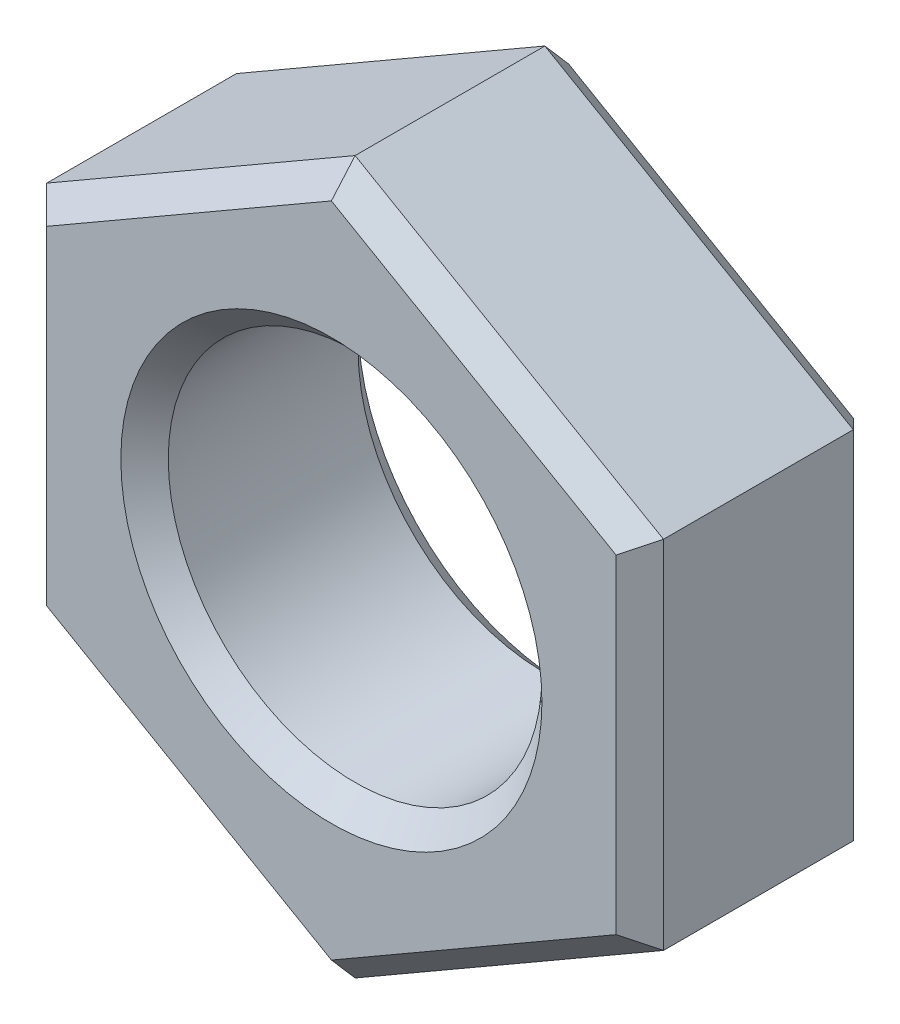
ISO-10303-21;
HEADER;
FILE_DESCRIPTION(('STEP AP214'),'2;1');
FILE_NAME('part.step','',(''),(''),'','','');
FILE_SCHEMA(('AUTOMOTIVE_DESIGN { 1 0 10303 214 1 1 1 1 }'));
ENDSEC;
DATA;
#1=APPLICATION_CONTEXT('core data for automotive mechanical design processes');
#2=APPLICATION_PROTOCOL_DEFINITION('international standard','automotive_design',2000,#1);
#3=PRODUCT_CONTEXT('',#1,'mechanical');
#4=PRODUCT('Part','Part','',(#3));
#5=PRODUCT_RELATED_PRODUCT_CATEGORY('part','',(#4));
#6=PRODUCT_DEFINITION_FORMATION('','',#4);
#7=PRODUCT_DEFINITION_CONTEXT('part definition',#1,'design');
#8=PRODUCT_DEFINITION('design','',#6,#7);
#9=PRODUCT_DEFINITION_SHAPE('','',#8);
#10=(LENGTH_UNIT() NAMED_UNIT(*) SI_UNIT(.MILLI.,.METRE.));
#11=(NAMED_UNIT(*) PLANE_ANGLE_UNIT() SI_UNIT($,.RADIAN.));
#12=(NAMED_UNIT(*) SI_UNIT($,.STERADIAN.) SOLID_ANGLE_UNIT());
#13=UNCERTAINTY_MEASURE_WITH_UNIT(LENGTH_MEASURE(1.E-05),#10,'distance_accuracy_value','');
#14=(GEOMETRIC_REPRESENTATION_CONTEXT(3) GLOBAL_UNCERTAINTY_ASSIGNED_CONTEXT((#13)) GLOBAL_UNIT_ASSIGNED_CONTEXT((#10,
#11,#12)) REPRESENTATION_CONTEXT('',''));
#15=CARTESIAN_POINT('',(0.,0.,0.));
#16=DIRECTION('',(0.,0.,1.));
#17=DIRECTION('',(1.,0.,0.));
#18=AXIS2_PLACEMENT_3D('',#15,#16,#17);
#19=CARTESIAN_POINT('',(0.,0.,1.));
#20=DIRECTION('',(0.,0.,1.));
#21=DIRECTION('',(1.,0.,0.));
#22=AXIS2_PLACEMENT_3D('',#19,#20,#21);
#23=PLANE('',#22);
#24=CARTESIAN_POINT('',(0.,0.,1.));
#25=DIRECTION('',(0.,0.,1.));
#26=DIRECTION('',(1.,0.,0.));
#27=AXIS2_PLACEMENT_3D('',#24,#25,#26);
#28=CIRCLE('',#27,1.775);
#29=CARTESIAN_POINT('',(1.775,0.,1.));
#30=VERTEX_POINT('',#29);
#31=EDGE_CURVE('E11',#30,#30,#28,.F.);
#32=ORIENTED_EDGE('',*,*,#31,.T.);
#33=EDGE_LOOP('',(#32));
#34=FACE_BOUND('',#33,.T.);
#35=DIRECTION('',(0.,-1.,0.));
#36=VECTOR('',#35,1.);
#37=CARTESIAN_POINT('',(-2.4,-1.50111069989303,1.));
#38=LINE('',#37,#36);
#39=CARTESIAN_POINT('',(-2.4,1.3856406460551,1.));
#40=VERTEX_POINT('',#39);
#41=CARTESIAN_POINT('',(-2.4,-1.3856406460551,1.));
#42=VERTEX_POINT('',#41);
#43=EDGE_CURVE('E56',#40,#42,#38,.T.);
#44=ORIENTED_EDGE('',*,*,#43,.T.);
#45=DIRECTION('',(0.866025403784439,-0.5,0.));
#46=VECTOR('',#45,1.);
#47=CARTESIAN_POINT('',(0.0999999999999995,-2.82901631902917,1.));
#48=LINE('',#47,#46);
#49=CARTESIAN_POINT('',(0.,-2.7712812921102,1.));
#50=VERTEX_POINT('',#49);
#51=EDGE_CURVE('E48',#42,#50,#48,.T.);
#52=ORIENTED_EDGE('',*,*,#51,.T.);
#53=DIRECTION('',(0.866025403784439,0.5,0.));
#54=VECTOR('',#53,1.);
#55=CARTESIAN_POINT('',(2.5,-1.32790561913614,1.));
#56=LINE('',#55,#54);
#57=CARTESIAN_POINT('',(2.4,-1.3856406460551,1.));
#58=VERTEX_POINT('',#57);
#59=EDGE_CURVE('E195',#50,#58,#56,.T.);
#60=ORIENTED_EDGE('',*,*,#59,.T.);
#61=DIRECTION('',(0.,1.,0.));
#62=VECTOR('',#61,1.);
#63=CARTESIAN_POINT('',(2.4,1.50111069989303,1.));
#64=LINE('',#63,#62);
#65=CARTESIAN_POINT('',(2.4,1.3856406460551,1.));
#66=VERTEX_POINT('',#65);
#67=EDGE_CURVE('E197',#58,#66,#64,.T.);
#68=ORIENTED_EDGE('',*,*,#67,.T.);
#69=DIRECTION('',(-0.866025403784439,0.5,0.));
#70=VECTOR('',#69,1.);
#71=CARTESIAN_POINT('',(-0.100000000000001,2.82901631902917,1.));
#72=LINE('',#71,#70);
#73=CARTESIAN_POINT('',(0.,2.7712812921102,1.));
#74=VERTEX_POINT('',#73);
#75=EDGE_CURVE('E199',#66,#74,#72,.T.);
#76=ORIENTED_EDGE('',*,*,#75,.T.);
#77=DIRECTION('',(-0.866025403784439,-0.5,0.));
#78=VECTOR('',#77,1.);
#79=CARTESIAN_POINT('',(-2.5,1.32790561913614,1.));
#80=LINE('',#79,#78);
#81=EDGE_CURVE('E61',#74,#40,#80,.T.);
#82=ORIENTED_EDGE('',*,*,#81,.T.);
#83=EDGE_LOOP('',(#44,#52,#60,#68,#76,#82));
#84=FACE_BOUND('',#83,.T.);
#85=ADVANCED_FACE('F38',(#34,#84),#23,.T.);
#86=CARTESIAN_POINT('',(0.,0.,-1.));
#87=DIRECTION('',(0.,0.,1.));
#88=DIRECTION('',(1.,0.,0.));
#89=AXIS2_PLACEMENT_3D('',#86,#87,#88);
#90=PLANE('',#89);
#91=CARTESIAN_POINT('',(0.,0.,-1.));
#92=DIRECTION('',(0.,0.,1.));
#93=DIRECTION('',(1.,0.,0.));
#94=AXIS2_PLACEMENT_3D('',#91,#92,#93);
#95=CIRCLE('',#94,1.775);
#96=CARTESIAN_POINT('',(-1.775,0.,-1.));
#97=VERTEX_POINT('',#96);
#98=EDGE_CURVE('E157',#97,#97,#95,.T.);
#99=ORIENTED_EDGE('',*,*,#98,.T.);
#100=EDGE_LOOP('',(#99));
#101=FACE_BOUND('',#100,.T.);
#102=DIRECTION('',(0.866025403784439,-0.5,0.));
#103=VECTOR('',#102,1.);
#104=CARTESIAN_POINT('',(1.2,2.07846096908265,-1.));
#105=LINE('',#104,#103);
#106=CARTESIAN_POINT('',(0.,2.7712812921102,-1.));
#107=VERTEX_POINT('',#106);
#108=CARTESIAN_POINT('',(2.4,1.3856406460551,-1.));
#109=VERTEX_POINT('',#108);
#110=EDGE_CURVE('E156',#107,#109,#105,.T.);
#111=ORIENTED_EDGE('',*,*,#110,.T.);
#112=DIRECTION('',(0.,-1.,0.));
#113=VECTOR('',#112,1.);
#114=CARTESIAN_POINT('',(2.4,0.,-1.));
#115=LINE('',#114,#113);
#116=CARTESIAN_POINT('',(2.4,-1.3856406460551,-1.));
#117=VERTEX_POINT('',#116);
#118=EDGE_CURVE('E135',#109,#117,#115,.T.);
#119=ORIENTED_EDGE('',*,*,#118,.T.);
#120=DIRECTION('',(-0.866025403784439,-0.5,0.));
#121=VECTOR('',#120,1.);
#122=CARTESIAN_POINT('',(1.2,-2.07846096908265,-1.));
#123=LINE('',#122,#121);
#124=CARTESIAN_POINT('',(0.,-2.7712812921102,-1.));
#125=VERTEX_POINT('',#124);
#126=EDGE_CURVE('E145',#117,#125,#123,.T.);
#127=ORIENTED_EDGE('',*,*,#126,.T.);
#128=DIRECTION('',(-0.866025403784439,0.5,0.));
#129=VECTOR('',#128,1.);
#130=CARTESIAN_POINT('',(-1.2,-2.07846096908265,-1.));
#131=LINE('',#130,#129);
#132=CARTESIAN_POINT('',(-2.4,-1.3856406460551,-1.));
#133=VERTEX_POINT('',#132);
#134=EDGE_CURVE('E151',#125,#133,#131,.T.);
#135=ORIENTED_EDGE('',*,*,#134,.T.);
#136=DIRECTION('',(0.,1.,0.));
#137=VECTOR('',#136,1.);
#138=CARTESIAN_POINT('',(-2.4,0.,-1.));
#139=LINE('',#138,#137);
#140=CARTESIAN_POINT('',(-2.4,1.3856406460551,-1.));
#141=VERTEX_POINT('',#140);
#142=EDGE_CURVE('E257',#133,#141,#139,.T.);
#143=ORIENTED_EDGE('',*,*,#142,.T.);
#144=DIRECTION('',(0.866025403784439,0.5,0.));
#145=VECTOR('',#144,1.);
#146=CARTESIAN_POINT('',(-1.2,2.07846096908265,-1.));
#147=LINE('',#146,#145);
#148=EDGE_CURVE('E162',#141,#107,#147,.T.);
#149=ORIENTED_EDGE('',*,*,#148,.T.);
#150=EDGE_LOOP('',(#111,#119,#127,#135,#143,#149));
#151=FACE_BOUND('',#150,.T.);
#152=ADVANCED_FACE('F154',(#101,#151),#90,.F.);
#153=CARTESIAN_POINT('',(0.,-3.00222139978606,1.));
#154=DIRECTION('',(-0.5,0.866025403784439,0.));
#155=DIRECTION('',(-0.866025403784439,-0.5,0.));
#156=AXIS2_PLACEMENT_3D('',#153,#154,#155);
#157=PLANE('',#156);
#158=DIRECTION('',(0.,0.,-1.));
#159=VECTOR('',#158,1.);
#160=CARTESIAN_POINT('',(0.,-3.00222139978606,1.));
#161=LINE('',#160,#159);
#162=CARTESIAN_POINT('',(0.,-3.00222139978606,0.799999999999999));
#163=VERTEX_POINT('',#162);
#164=CARTESIAN_POINT('',(0.,-3.00222139978606,-0.799999999999999));
#165=VERTEX_POINT('',#164);
#166=EDGE_CURVE('E214',#163,#165,#161,.T.);
#167=ORIENTED_EDGE('',*,*,#166,.T.);
#168=DIRECTION('',(0.866025403784439,0.5,0.));
#169=VECTOR('',#168,1.);
#170=CARTESIAN_POINT('',(0.,-3.00222139978606,-0.799999999999999));
#171=LINE('',#170,#169);
#172=CARTESIAN_POINT('',(2.6,-1.50111069989303,-0.799999999999999));
#173=VERTEX_POINT('',#172);
#174=EDGE_CURVE('E193',#165,#173,#171,.T.);
#175=ORIENTED_EDGE('',*,*,#174,.T.);
#176=DIRECTION('',(0.,0.,-1.));
#177=VECTOR('',#176,1.);
#178=CARTESIAN_POINT('',(2.6,-1.50111069989303,1.));
#179=LINE('',#178,#177);
#180=CARTESIAN_POINT('',(2.6,-1.50111069989303,0.799999999999999));
#181=VERTEX_POINT('',#180);
#182=EDGE_CURVE('E152',#181,#173,#179,.T.);
#183=ORIENTED_EDGE('',*,*,#182,.F.);
#184=DIRECTION('',(-0.866025403784439,-0.5,0.));
#185=VECTOR('',#184,1.);
#186=CARTESIAN_POINT('',(0.,-3.00222139978606,0.799999999999999));
#187=LINE('',#186,#185);
#188=EDGE_CURVE('E191',#181,#163,#187,.T.);
#189=ORIENTED_EDGE('',*,*,#188,.T.);
#190=EDGE_LOOP('',(#167,#175,#183,#189));
#191=FACE_BOUND('',#190,.T.);
#192=ADVANCED_FACE('F281',(#191),#157,.F.);
#193=CARTESIAN_POINT('',(2.6,-1.50111069989303,1.));
#194=DIRECTION('',(-1.,0.,0.));
#195=DIRECTION('',(0.,-1.,0.));
#196=AXIS2_PLACEMENT_3D('',#193,#194,#195);
#197=PLANE('',#196);
#198=ORIENTED_EDGE('',*,*,#182,.T.);
#199=DIRECTION('',(0.,1.,0.));
#200=VECTOR('',#199,1.);
#201=CARTESIAN_POINT('',(2.6,-1.50111069989303,-0.799999999999999));
#202=LINE('',#201,#200);
#203=CARTESIAN_POINT('',(2.6,1.50111069989303,-0.799999999999999));
#204=VERTEX_POINT('',#203);
#205=EDGE_CURVE('E138',#173,#204,#202,.T.);
#206=ORIENTED_EDGE('',*,*,#205,.T.);
#207=DIRECTION('',(0.,0.,-1.));
#208=VECTOR('',#207,1.);
#209=CARTESIAN_POINT('',(2.6,1.50111069989303,1.));
#210=LINE('',#209,#208);
#211=CARTESIAN_POINT('',(2.6,1.50111069989303,0.799999999999999));
#212=VERTEX_POINT('',#211);
#213=EDGE_CURVE('E243',#212,#204,#210,.T.);
#214=ORIENTED_EDGE('',*,*,#213,.F.);
#215=DIRECTION('',(0.,-1.,0.));
#216=VECTOR('',#215,1.);
#217=CARTESIAN_POINT('',(2.6,-1.50111069989303,0.799999999999999));
#218=LINE('',#217,#216);
#219=EDGE_CURVE('E171',#212,#181,#218,.T.);
#220=ORIENTED_EDGE('',*,*,#219,.T.);
#221=EDGE_LOOP('',(#198,#206,#214,#220));
#222=FACE_BOUND('',#221,.T.);
#223=ADVANCED_FACE('F248',(#222),#197,.F.);
#224=CARTESIAN_POINT('',(2.6,1.50111069989303,1.));
#225=DIRECTION('',(-0.5,-0.866025403784439,0.));
#226=DIRECTION('',(0.866025403784439,-0.5,0.));
#227=AXIS2_PLACEMENT_3D('',#224,#225,#226);
#228=PLANE('',#227);
#229=ORIENTED_EDGE('',*,*,#213,.T.);
#230=DIRECTION('',(-0.866025403784439,0.5,0.));
#231=VECTOR('',#230,1.);
#232=CARTESIAN_POINT('',(2.6,1.50111069989303,-0.799999999999999));
#233=LINE('',#232,#231);
#234=CARTESIAN_POINT('',(0.,3.00222139978606,-0.799999999999999));
#235=VERTEX_POINT('',#234);
#236=EDGE_CURVE('E176',#204,#235,#233,.T.);
#237=ORIENTED_EDGE('',*,*,#236,.T.);
#238=DIRECTION('',(0.,0.,-1.));
#239=VECTOR('',#238,1.);
#240=CARTESIAN_POINT('',(0.,3.00222139978606,1.));
#241=LINE('',#240,#239);
#242=CARTESIAN_POINT('',(0.,3.00222139978606,0.8));
#243=VERTEX_POINT('',#242);
#244=EDGE_CURVE('E245',#243,#235,#241,.T.);
#245=ORIENTED_EDGE('',*,*,#244,.F.);
#246=DIRECTION('',(0.866025403784439,-0.5,0.));
#247=VECTOR('',#246,1.);
#248=CARTESIAN_POINT('',(2.6,1.50111069989303,0.8));
#249=LINE('',#248,#247);
#250=EDGE_CURVE('E174',#243,#212,#249,.T.);
#251=ORIENTED_EDGE('',*,*,#250,.T.);
#252=EDGE_LOOP('',(#229,#237,#245,#251));
#253=FACE_BOUND('',#252,.T.);
#254=ADVANCED_FACE('F242',(#253),#228,.F.);
#255=CARTESIAN_POINT('',(0.,3.00222139978606,1.));
#256=DIRECTION('',(0.5,-0.866025403784439,0.));
#257=DIRECTION('',(0.866025403784439,0.5,0.));
#258=AXIS2_PLACEMENT_3D('',#255,#256,#257);
#259=PLANE('',#258);
#260=ORIENTED_EDGE('',*,*,#244,.T.);
#261=DIRECTION('',(-0.866025403784439,-0.5,0.));
#262=VECTOR('',#261,1.);
#263=CARTESIAN_POINT('',(0.,3.00222139978606,-0.799999999999999));
#264=LINE('',#263,#262);
#265=CARTESIAN_POINT('',(-2.6,1.50111069989303,-0.799999999999999));
#266=VERTEX_POINT('',#265);
#267=EDGE_CURVE('E180',#235,#266,#264,.T.);
#268=ORIENTED_EDGE('',*,*,#267,.T.);
#269=DIRECTION('',(0.,0.,-1.));
#270=VECTOR('',#269,1.);
#271=CARTESIAN_POINT('',(-2.6,1.50111069989303,1.));
#272=LINE('',#271,#270);
#273=CARTESIAN_POINT('',(-2.6,1.50111069989303,0.8));
#274=VERTEX_POINT('',#273);
#275=EDGE_CURVE('E252',#274,#266,#272,.T.);
#276=ORIENTED_EDGE('',*,*,#275,.F.);
#277=DIRECTION('',(0.866025403784439,0.5,0.));
#278=VECTOR('',#277,1.);
#279=CARTESIAN_POINT('',(0.,3.00222139978606,0.8));
#280=LINE('',#279,#278);
#281=EDGE_CURVE('E178',#274,#243,#280,.T.);
#282=ORIENTED_EDGE('',*,*,#281,.T.);
#283=EDGE_LOOP('',(#260,#268,#276,#282));
#284=FACE_BOUND('',#283,.T.);
#285=ADVANCED_FACE('F269',(#284),#259,.F.);
#286=CARTESIAN_POINT('',(-2.6,1.50111069989303,1.));
#287=DIRECTION('',(1.,0.,0.));
#288=DIRECTION('',(0.,0.,-1.));
#289=AXIS2_PLACEMENT_3D('',#286,#287,#288);
#290=PLANE('',#289);
#291=ORIENTED_EDGE('',*,*,#275,.T.);
#292=DIRECTION('',(0.,-1.,0.));
#293=VECTOR('',#292,1.);
#294=CARTESIAN_POINT('',(-2.6,1.50111069989303,-0.799999999999999));
#295=LINE('',#294,#293);
#296=CARTESIAN_POINT('',(-2.6,-1.50111069989303,-0.8));
#297=VERTEX_POINT('',#296);
#298=EDGE_CURVE('E184',#266,#297,#295,.T.);
#299=ORIENTED_EDGE('',*,*,#298,.T.);
#300=DIRECTION('',(0.,0.,-1.));
#301=VECTOR('',#300,1.);
#302=CARTESIAN_POINT('',(-2.6,-1.50111069989303,1.));
#303=LINE('',#302,#301);
#304=CARTESIAN_POINT('',(-2.6,-1.50111069989303,0.799999999999999));
#305=VERTEX_POINT('',#304);
#306=EDGE_CURVE('E274',#305,#297,#303,.T.);
#307=ORIENTED_EDGE('',*,*,#306,.F.);
#308=DIRECTION('',(0.,1.,0.));
#309=VECTOR('',#308,1.);
#310=CARTESIAN_POINT('',(-2.6,1.50111069989303,0.799999999999999));
#311=LINE('',#310,#309);
#312=EDGE_CURVE('E182',#305,#274,#311,.T.);
#313=ORIENTED_EDGE('',*,*,#312,.T.);
#314=EDGE_LOOP('',(#291,#299,#307,#313));
#315=FACE_BOUND('',#314,.T.);
#316=ADVANCED_FACE('F292',(#315),#290,.F.);
#317=CARTESIAN_POINT('',(-2.6,-1.50111069989303,1.));
#318=DIRECTION('',(0.5,0.866025403784439,0.));
#319=DIRECTION('',(-0.866025403784439,0.5,0.));
#320=AXIS2_PLACEMENT_3D('',#317,#318,#319);
#321=PLANE('',#320);
#322=ORIENTED_EDGE('',*,*,#306,.T.);
#323=DIRECTION('',(0.866025403784439,-0.5,0.));
#324=VECTOR('',#323,1.);
#325=CARTESIAN_POINT('',(-2.6,-1.50111069989303,-0.8));
#326=LINE('',#325,#324);
#327=EDGE_CURVE('E189',#297,#165,#326,.T.);
#328=ORIENTED_EDGE('',*,*,#327,.T.);
#329=ORIENTED_EDGE('',*,*,#166,.F.);
#330=DIRECTION('',(-0.866025403784439,0.5,0.));
#331=VECTOR('',#330,1.);
#332=CARTESIAN_POINT('',(-2.6,-1.50111069989303,0.799999999999999));
#333=LINE('',#332,#331);
#334=EDGE_CURVE('E186',#163,#305,#333,.T.);
#335=ORIENTED_EDGE('',*,*,#334,.T.);
#336=EDGE_LOOP('',(#322,#328,#329,#335));
#337=FACE_BOUND('',#336,.T.);
#338=ADVANCED_FACE('F293',(#337),#321,.F.);
#339=CARTESIAN_POINT('',(0.,0.,1.));
#340=DIRECTION('',(0.,0.,-1.));
#341=DIRECTION('',(-1.,0.,0.));
#342=AXIS2_PLACEMENT_3D('',#339,#340,#341);
#343=CYLINDRICAL_SURFACE('',#342,1.575);
#344=CARTESIAN_POINT('',(0.,0.,-0.8));
#345=DIRECTION('',(0.,0.,1.));
#346=DIRECTION('',(1.,0.,0.));
#347=AXIS2_PLACEMENT_3D('',#344,#345,#346);
#348=CIRCLE('',#347,1.575);
#349=CARTESIAN_POINT('',(-1.575,0.,-0.8));
#350=VERTEX_POINT('',#349);
#351=EDGE_CURVE('E168',#350,#350,#348,.F.);
#352=ORIENTED_EDGE('',*,*,#351,.T.);
#353=EDGE_LOOP('',(#352));
#354=FACE_BOUND('',#353,.T.);
#355=CARTESIAN_POINT('',(0.,0.,0.799999999999999));
#356=DIRECTION('',(0.,0.,1.));
#357=DIRECTION('',(1.,0.,0.));
#358=AXIS2_PLACEMENT_3D('',#355,#356,#357);
#359=CIRCLE('',#358,1.575);
#360=CARTESIAN_POINT('',(1.575,0.,0.799999999999999));
#361=VERTEX_POINT('',#360);
#362=EDGE_CURVE('E160',#361,#361,#359,.T.);
#363=ORIENTED_EDGE('',*,*,#362,.T.);
#364=EDGE_LOOP('',(#363));
#365=FACE_BOUND('',#364,.T.);
#366=ADVANCED_FACE('F312',(#354,#365),#343,.F.);
#367=CARTESIAN_POINT('',(0.,0.,-1.));
#368=DIRECTION('',(0.,0.,-1.));
#369=DIRECTION('',(-1.,0.,0.));
#370=AXIS2_PLACEMENT_3D('',#367,#368,#369);
#371=CONICAL_SURFACE('',#370,1.775,0.785398163397446);
#372=CARTESIAN_POINT('',(-1.575,0.,-0.8));
#373=CARTESIAN_POINT('',(-1.57708333333333,0.,-0.802083333333334));
#374=CARTESIAN_POINT('',(-1.57916666666667,0.,-0.804166666666667));
#375=CARTESIAN_POINT('',(-1.58333333333333,0.,-0.808333333333334));
#376=CARTESIAN_POINT('',(-1.58541666666667,0.,-0.810416666666667));
#377=CARTESIAN_POINT('',(-1.58958333333333,0.,-0.814583333333334));
#378=CARTESIAN_POINT('',(-1.59166666666667,0.,-0.816666666666667));
#379=CARTESIAN_POINT('',(-1.59583333333333,0.,-0.820833333333334));
#380=CARTESIAN_POINT('',(-1.59791666666667,0.,-0.822916666666667));
#381=CARTESIAN_POINT('',(-1.60208333333333,0.,-0.827083333333334));
#382=CARTESIAN_POINT('',(-1.60416666666667,0.,-0.829166666666667));
#383=CARTESIAN_POINT('',(-1.60833333333333,0.,-0.833333333333333));
#384=CARTESIAN_POINT('',(-1.61041666666667,0.,-0.835416666666667));
#385=CARTESIAN_POINT('',(-1.61458333333333,0.,-0.839583333333334));
#386=CARTESIAN_POINT('',(-1.61666666666667,0.,-0.841666666666667));
#387=CARTESIAN_POINT('',(-1.62083333333333,0.,-0.845833333333334));
#388=CARTESIAN_POINT('',(-1.62291666666667,0.,-0.847916666666667));
#389=CARTESIAN_POINT('',(-1.62708333333333,0.,-0.852083333333334));
#390=CARTESIAN_POINT('',(-1.62916666666667,0.,-0.854166666666667));
#391=CARTESIAN_POINT('',(-1.63333333333333,0.,-0.858333333333334));
#392=CARTESIAN_POINT('',(-1.63541666666667,0.,-0.860416666666667));
#393=CARTESIAN_POINT('',(-1.63958333333333,0.,-0.864583333333333));
#394=CARTESIAN_POINT('',(-1.64166666666667,0.,-0.866666666666667));
#395=CARTESIAN_POINT('',(-1.64583333333333,0.,-0.870833333333333));
#396=CARTESIAN_POINT('',(-1.64791666666667,0.,-0.872916666666667));
#397=CARTESIAN_POINT('',(-1.65208333333333,0.,-0.877083333333334));
#398=CARTESIAN_POINT('',(-1.65416666666667,0.,-0.879166666666667));
#399=CARTESIAN_POINT('',(-1.65833333333333,0.,-0.883333333333334));
#400=CARTESIAN_POINT('',(-1.66041666666667,0.,-0.885416666666667));
#401=CARTESIAN_POINT('',(-1.66458333333333,0.,-0.889583333333334));
#402=CARTESIAN_POINT('',(-1.66666666666667,0.,-0.891666666666667));
#403=CARTESIAN_POINT('',(-1.67083333333333,0.,-0.895833333333334));
#404=CARTESIAN_POINT('',(-1.67291666666667,0.,-0.897916666666667));
#405=CARTESIAN_POINT('',(-1.67708333333333,0.,-0.902083333333333));
#406=CARTESIAN_POINT('',(-1.67916666666667,0.,-0.904166666666667));
#407=CARTESIAN_POINT('',(-1.68333333333333,0.,-0.908333333333333));
#408=CARTESIAN_POINT('',(-1.68541666666667,0.,-0.910416666666667));
#409=CARTESIAN_POINT('',(-1.68958333333333,0.,-0.914583333333333));
#410=CARTESIAN_POINT('',(-1.69166666666667,0.,-0.916666666666667));
#411=CARTESIAN_POINT('',(-1.69583333333333,0.,-0.920833333333334));
#412=CARTESIAN_POINT('',(-1.69791666666667,0.,-0.922916666666667));
#413=CARTESIAN_POINT('',(-1.70208333333333,0.,-0.927083333333333));
#414=CARTESIAN_POINT('',(-1.70416666666667,0.,-0.929166666666667));
#415=CARTESIAN_POINT('',(-1.70833333333333,0.,-0.933333333333334));
#416=CARTESIAN_POINT('',(-1.71041666666667,0.,-0.935416666666667));
#417=CARTESIAN_POINT('',(-1.71458333333333,0.,-0.939583333333334));
#418=CARTESIAN_POINT('',(-1.71666666666667,0.,-0.941666666666667));
#419=CARTESIAN_POINT('',(-1.72083333333333,0.,-0.945833333333333));
#420=CARTESIAN_POINT('',(-1.72291666666667,0.,-0.947916666666667));
#421=CARTESIAN_POINT('',(-1.72708333333333,0.,-0.952083333333334));
#422=CARTESIAN_POINT('',(-1.72916666666667,0.,-0.954166666666667));
#423=CARTESIAN_POINT('',(-1.73333333333333,0.,-0.958333333333333));
#424=CARTESIAN_POINT('',(-1.73541666666667,0.,-0.960416666666667));
#425=CARTESIAN_POINT('',(-1.73958333333333,0.,-0.964583333333333));
#426=CARTESIAN_POINT('',(-1.74166666666667,0.,-0.966666666666667));
#427=CARTESIAN_POINT('',(-1.74583333333333,0.,-0.970833333333333));
#428=CARTESIAN_POINT('',(-1.74791666666667,0.,-0.972916666666667));
#429=CARTESIAN_POINT('',(-1.75208333333333,0.,-0.977083333333334));
#430=CARTESIAN_POINT('',(-1.75416666666667,0.,-0.979166666666667));
#431=CARTESIAN_POINT('',(-1.75833333333333,0.,-0.983333333333334));
#432=CARTESIAN_POINT('',(-1.76041666666667,0.,-0.985416666666667));
#433=CARTESIAN_POINT('',(-1.76458333333333,0.,-0.989583333333333));
#434=CARTESIAN_POINT('',(-1.76666666666667,0.,-0.991666666666667));
#435=CARTESIAN_POINT('',(-1.77083333333333,0.,-0.995833333333333));
#436=CARTESIAN_POINT('',(-1.77291666666667,0.,-0.997916666666667));
#437=CARTESIAN_POINT('',(-1.775,0.,-1.));
#438=B_SPLINE_CURVE_WITH_KNOTS('',3,(#372,#373,#374,#375,#376,#377,#378,#379,#380,#381,#382,
#383,#384,#385,#386,#387,#388,#389,#390,#391,#392,#393,#394,#395,#396,#397,#398,#399,#400,#401,
#402,#403,#404,#405,#406,#407,#408,#409,#410,#411,#412,#413,#414,#415,#416,#417,#418,#419,#420,
#421,#422,#423,#424,#425,#426,#427,#428,#429,#430,#431,#432,#433,#434,#435,#436,#437),
.UNSPECIFIED.,.F.,.F.,(4,2,2,2,2,2,2,2,2,2,2,2,2,2,2,2,2,2,2,2,2,2,2,2,2,2,2,2,2,2,2,2,4),(0.,
0.00883883476483179,0.0176776695296637,0.0265165042944954,0.0353553390593272,0.044194173824159,
0.0530330085889909,0.0618718433538227,0.0707106781186545,0.0795495128834863,0.0883883476483181,
0.0972271824131499,0.106066017177982,0.114904851942814,0.123743686707645,0.132582521472477,
0.141421356237309,0.150260191002141,0.159099025766973,0.167937860531804,0.176776695296636,
0.185615530061468,0.1944543648263,0.203293199591132,0.212132034355964,0.220970869120795,
0.229809703885627,0.238648538650459,0.247487373415291,0.256326208180123,0.265165042944954,
0.274003877709786,0.282842712474618),.UNSPECIFIED.);
#439=EDGE_CURVE('BSEAM327',#350,#97,#438,.T.);
#440=ORIENTED_EDGE('',*,*,#351,.F.);
#441=ORIENTED_EDGE('',*,*,#98,.F.);
#442=ORIENTED_EDGE('',*,*,#439,.T.);
#443=ORIENTED_EDGE('',*,*,#439,.F.);
#444=EDGE_LOOP('',(#440,#442,#441,#443));
#445=FACE_BOUND('',#444,.T.);
#446=ADVANCED_FACE('F327',(#445),#371,.F.);
#447=CARTESIAN_POINT('',(-2.6,1.50111069989303,-0.799999999999999));
#448=DIRECTION('',(0.707106781186546,0.,0.707106781186549));
#449=DIRECTION('',(0.,-1.,0.));
#450=AXIS2_PLACEMENT_3D('',#447,#448,#449);
#451=PLANE('',#450);
#452=DIRECTION('',(0.654653670707978,-0.377964473009228,-0.654653670707976));
#453=VECTOR('',#452,1.);
#454=CARTESIAN_POINT('',(-2.6,1.50111069989303,-0.799999999999999));
#455=LINE('',#454,#453);
#456=EDGE_CURVE('E208',#141,#266,#455,.F.);
#457=ORIENTED_EDGE('',*,*,#456,.F.);
#458=ORIENTED_EDGE('',*,*,#142,.F.);
#459=DIRECTION('',(0.654653670707979,0.377964473009227,-0.654653670707976));
#460=VECTOR('',#459,1.);
#461=CARTESIAN_POINT('',(-2.6,-1.50111069989303,-0.799999999999999));
#462=LINE('',#461,#460);
#463=EDGE_CURVE('E211',#297,#133,#462,.T.);
#464=ORIENTED_EDGE('',*,*,#463,.F.);
#465=ORIENTED_EDGE('',*,*,#298,.F.);
#466=EDGE_LOOP('',(#457,#458,#464,#465));
#467=FACE_BOUND('',#466,.T.);
#468=ADVANCED_FACE('F290',(#467),#451,.F.);
#469=CARTESIAN_POINT('',(-2.6,-1.50111069989303,-0.799999999999999));
#470=DIRECTION('',(0.353553390593273,0.612372435695794,0.707106781186548));
#471=DIRECTION('',(0.866025403784439,-0.5,0.));
#472=AXIS2_PLACEMENT_3D('',#469,#470,#471);
#473=PLANE('',#472);
#474=ORIENTED_EDGE('',*,*,#463,.T.);
#475=ORIENTED_EDGE('',*,*,#134,.F.);
#476=DIRECTION('',(0.,0.755928946018455,-0.654653670707976));
#477=VECTOR('',#476,1.);
#478=CARTESIAN_POINT('',(0.,-3.00222139978606,-0.799999999999999));
#479=LINE('',#478,#477);
#480=EDGE_CURVE('E148',#165,#125,#479,.T.);
#481=ORIENTED_EDGE('',*,*,#480,.F.);
#482=ORIENTED_EDGE('',*,*,#327,.F.);
#483=EDGE_LOOP('',(#474,#475,#481,#482));
#484=FACE_BOUND('',#483,.T.);
#485=ADVANCED_FACE('F287',(#484),#473,.F.);
#486=CARTESIAN_POINT('',(0.,3.00222139978606,-0.799999999999999));
#487=DIRECTION('',(0.353553390593273,-0.612372435695793,0.707106781186549));
#488=DIRECTION('',(-0.866025403784439,-0.5,0.));
#489=AXIS2_PLACEMENT_3D('',#486,#487,#488);
#490=PLANE('',#489);
#491=ORIENTED_EDGE('',*,*,#456,.T.);
#492=ORIENTED_EDGE('',*,*,#267,.F.);
#493=DIRECTION('',(0.,-0.755928946018456,-0.654653670707975));
#494=VECTOR('',#493,1.);
#495=CARTESIAN_POINT('',(0.,3.00222139978606,-0.799999999999999));
#496=LINE('',#495,#494);
#497=EDGE_CURVE('E141',#107,#235,#496,.F.);
#498=ORIENTED_EDGE('',*,*,#497,.F.);
#499=ORIENTED_EDGE('',*,*,#148,.F.);
#500=EDGE_LOOP('',(#491,#492,#498,#499));
#501=FACE_BOUND('',#500,.T.);
#502=ADVANCED_FACE('F264',(#501),#490,.F.);
#503=CARTESIAN_POINT('',(0.,-3.00222139978606,-0.799999999999999));
#504=DIRECTION('',(-0.353553390593273,0.612372435695794,0.707106781186549));
#505=DIRECTION('',(0.866025403784439,0.5,0.));
#506=AXIS2_PLACEMENT_3D('',#503,#504,#505);
#507=PLANE('',#506);
#508=ORIENTED_EDGE('',*,*,#480,.T.);
#509=ORIENTED_EDGE('',*,*,#126,.F.);
#510=DIRECTION('',(0.654653670707979,-0.377964473009227,0.654653670707976));
#511=VECTOR('',#510,1.);
#512=CARTESIAN_POINT('',(1.85714285714285,-1.07222192849502,-1.54285714285714));
#513=LINE('',#512,#511);
#514=EDGE_CURVE('E131',#173,#117,#513,.F.);
#515=ORIENTED_EDGE('',*,*,#514,.F.);
#516=ORIENTED_EDGE('',*,*,#174,.F.);
#517=EDGE_LOOP('',(#508,#509,#515,#516));
#518=FACE_BOUND('',#517,.T.);
#519=ADVANCED_FACE('F146',(#518),#507,.F.);
#520=CARTESIAN_POINT('',(2.6,1.50111069989303,-0.799999999999999));
#521=DIRECTION('',(-0.353553390593273,-0.612372435695793,0.70710678118655));
#522=DIRECTION('',(-0.866025403784439,0.5,0.));
#523=AXIS2_PLACEMENT_3D('',#520,#521,#522);
#524=PLANE('',#523);
#525=ORIENTED_EDGE('',*,*,#497,.T.);
#526=ORIENTED_EDGE('',*,*,#236,.F.);
#527=DIRECTION('',(-0.654653670707978,-0.377964473009229,-0.654653670707975));
#528=VECTOR('',#527,1.);
#529=CARTESIAN_POINT('',(2.6,1.50111069989303,-0.799999999999999));
#530=LINE('',#529,#528);
#531=EDGE_CURVE('E142',#109,#204,#530,.F.);
#532=ORIENTED_EDGE('',*,*,#531,.F.);
#533=ORIENTED_EDGE('',*,*,#110,.F.);
#534=EDGE_LOOP('',(#525,#526,#532,#533));
#535=FACE_BOUND('',#534,.T.);
#536=ADVANCED_FACE('F267',(#535),#524,.F.);
#537=CARTESIAN_POINT('',(2.6,-1.50111069989303,-0.799999999999999));
#538=DIRECTION('',(-0.707106781186546,0.,0.707106781186549));
#539=DIRECTION('',(0.,1.,0.));
#540=AXIS2_PLACEMENT_3D('',#537,#538,#539);
#541=PLANE('',#540);
#542=ORIENTED_EDGE('',*,*,#514,.T.);
#543=ORIENTED_EDGE('',*,*,#118,.F.);
#544=ORIENTED_EDGE('',*,*,#531,.T.);
#545=ORIENTED_EDGE('',*,*,#205,.F.);
#546=EDGE_LOOP('',(#542,#543,#544,#545));
#547=FACE_BOUND('',#546,.T.);
#548=ADVANCED_FACE('F133',(#547),#541,.F.);
#549=CARTESIAN_POINT('',(0.,0.,0.799999999999999));
#550=DIRECTION('',(0.,0.,1.));
#551=DIRECTION('',(1.,0.,0.));
#552=AXIS2_PLACEMENT_3D('',#549,#550,#551);
#553=CONICAL_SURFACE('',#552,1.575,0.785398163397451);
#554=ORIENTED_EDGE('',*,*,#31,.F.);
#555=EDGE_LOOP('',(#554));
#556=FACE_BOUND('',#555,.T.);
#557=ORIENTED_EDGE('',*,*,#362,.F.);
#558=EDGE_LOOP('',(#557));
#559=FACE_BOUND('',#558,.T.);
#560=ADVANCED_FACE('F341',(#556,#559),#553,.F.);
#561=CARTESIAN_POINT('',(1.2,2.07846096908265,1.));
#562=DIRECTION('',(0.353553390593274,0.612372435695794,0.707106781186548));
#563=DIRECTION('',(0.866025403784439,-0.5,0.));
#564=AXIS2_PLACEMENT_3D('',#561,#562,#563);
#565=PLANE('',#564);
#566=DIRECTION('',(-0.654653670707977,-0.377964473009228,0.654653670707977));
#567=VECTOR('',#566,1.);
#568=CARTESIAN_POINT('',(2.05714285714286,1.18769198233295,1.34285714285714));
#569=LINE('',#568,#567);
#570=EDGE_CURVE('E224',#212,#66,#569,.T.);
#571=ORIENTED_EDGE('',*,*,#570,.F.);
#572=ORIENTED_EDGE('',*,*,#250,.F.);
#573=DIRECTION('',(0.,-0.755928946018455,0.654653670707977));
#574=VECTOR('',#573,1.);
#575=CARTESIAN_POINT('',(0.,2.37538396466589,1.34285714285714));
#576=LINE('',#575,#574);
#577=EDGE_CURVE('E43',#74,#243,#576,.F.);
#578=ORIENTED_EDGE('',*,*,#577,.F.);
#579=ORIENTED_EDGE('',*,*,#75,.F.);
#580=EDGE_LOOP('',(#571,#572,#578,#579));
#581=FACE_BOUND('',#580,.T.);
#582=ADVANCED_FACE('F41',(#581),#565,.T.);
#583=CARTESIAN_POINT('',(-1.2,2.07846096908265,1.));
#584=DIRECTION('',(-0.353553390593273,0.612372435695794,0.707106781186548));
#585=DIRECTION('',(0.866025403784439,0.5,0.));
#586=AXIS2_PLACEMENT_3D('',#583,#584,#585);
#587=PLANE('',#586);
#588=ORIENTED_EDGE('',*,*,#577,.T.);
#589=ORIENTED_EDGE('',*,*,#281,.F.);
#590=DIRECTION('',(0.654653670707977,-0.377964473009229,0.654653670707977));
#591=VECTOR('',#590,1.);
#592=CARTESIAN_POINT('',(-2.05714285714286,1.18769198233295,1.34285714285714));
#593=LINE('',#592,#591);
#594=EDGE_CURVE('E222',#40,#274,#593,.F.);
#595=ORIENTED_EDGE('',*,*,#594,.F.);
#596=ORIENTED_EDGE('',*,*,#81,.F.);
#597=EDGE_LOOP('',(#588,#589,#595,#596));
#598=FACE_BOUND('',#597,.T.);
#599=ADVANCED_FACE('F234',(#598),#587,.T.);
#600=CARTESIAN_POINT('',(2.4,0.,1.));
#601=DIRECTION('',(0.707106781186547,0.,0.707106781186547));
#602=DIRECTION('',(0.,-1.,0.));
#603=AXIS2_PLACEMENT_3D('',#600,#601,#602);
#604=PLANE('',#603);
#605=ORIENTED_EDGE('',*,*,#570,.T.);
#606=ORIENTED_EDGE('',*,*,#67,.F.);
#607=DIRECTION('',(-0.654653670707978,0.377964473009226,0.654653670707977));
#608=VECTOR('',#607,1.);
#609=CARTESIAN_POINT('',(2.05714285714286,-1.18769198233295,1.34285714285714));
#610=LINE('',#609,#608);
#611=EDGE_CURVE('E219',#181,#58,#610,.T.);
#612=ORIENTED_EDGE('',*,*,#611,.F.);
#613=ORIENTED_EDGE('',*,*,#219,.F.);
#614=EDGE_LOOP('',(#605,#606,#612,#613));
#615=FACE_BOUND('',#614,.T.);
#616=ADVANCED_FACE('F387',(#615),#604,.T.);
#617=CARTESIAN_POINT('',(-2.4,0.,1.));
#618=DIRECTION('',(-0.707106781186547,0.,0.707106781186547));
#619=DIRECTION('',(0.,1.,0.));
#620=AXIS2_PLACEMENT_3D('',#617,#618,#619);
#621=PLANE('',#620);
#622=ORIENTED_EDGE('',*,*,#594,.T.);
#623=ORIENTED_EDGE('',*,*,#312,.F.);
#624=DIRECTION('',(0.654653670707977,0.377964473009227,0.654653670707977));
#625=VECTOR('',#624,1.);
#626=CARTESIAN_POINT('',(-2.05714285714286,-1.18769198233294,1.34285714285714));
#627=LINE('',#626,#625);
#628=EDGE_CURVE('E217',#42,#305,#627,.F.);
#629=ORIENTED_EDGE('',*,*,#628,.F.);
#630=ORIENTED_EDGE('',*,*,#43,.F.);
#631=EDGE_LOOP('',(#622,#623,#629,#630));
#632=FACE_BOUND('',#631,.T.);
#633=ADVANCED_FACE('F381',(#632),#621,.T.);
#634=CARTESIAN_POINT('',(1.2,-2.07846096908265,1.));
#635=DIRECTION('',(0.353553390593274,-0.612372435695795,0.707106781186547));
#636=DIRECTION('',(-0.866025403784439,-0.5,0.));
#637=AXIS2_PLACEMENT_3D('',#634,#635,#636);
#638=PLANE('',#637);
#639=ORIENTED_EDGE('',*,*,#611,.T.);
#640=ORIENTED_EDGE('',*,*,#59,.F.);
#641=DIRECTION('',(0.,-0.755928946018454,-0.654653670707977));
#642=VECTOR('',#641,1.);
#643=CARTESIAN_POINT('',(0.,-2.37538396466589,1.34285714285714));
#644=LINE('',#643,#642);
#645=EDGE_CURVE('E215',#163,#50,#644,.F.);
#646=ORIENTED_EDGE('',*,*,#645,.F.);
#647=ORIENTED_EDGE('',*,*,#188,.F.);
#648=EDGE_LOOP('',(#639,#640,#646,#647));
#649=FACE_BOUND('',#648,.T.);
#650=ADVANCED_FACE('F301',(#649),#638,.T.);
#651=CARTESIAN_POINT('',(-1.2,-2.07846096908265,1.));
#652=DIRECTION('',(-0.353553390593274,-0.612372435695794,0.707106781186547));
#653=DIRECTION('',(-0.866025403784439,0.5,0.));
#654=AXIS2_PLACEMENT_3D('',#651,#652,#653);
#655=PLANE('',#654);
#656=ORIENTED_EDGE('',*,*,#628,.T.);
#657=ORIENTED_EDGE('',*,*,#334,.F.);
#658=ORIENTED_EDGE('',*,*,#645,.T.);
#659=ORIENTED_EDGE('',*,*,#51,.F.);
#660=EDGE_LOOP('',(#656,#657,#658,#659));
#661=FACE_BOUND('',#660,.T.);
#662=ADVANCED_FACE('F296',(#661),#655,.T.);
#663=CLOSED_SHELL('',(#85,#152,#192,#223,#254,#285,#316,#338,#366,#446,#468,#485,#502,#519,#536,
#548,#560,#582,#599,#616,#633,#650,#662));
#664=MANIFOLD_SOLID_BREP('B2',#663);
#665=ADVANCED_BREP_SHAPE_REPRESENTATION('',(#18,#664),#14);
#666=SHAPE_DEFINITION_REPRESENTATION(#9,#665);
ENDSEC;
END-ISO-10303-21;
